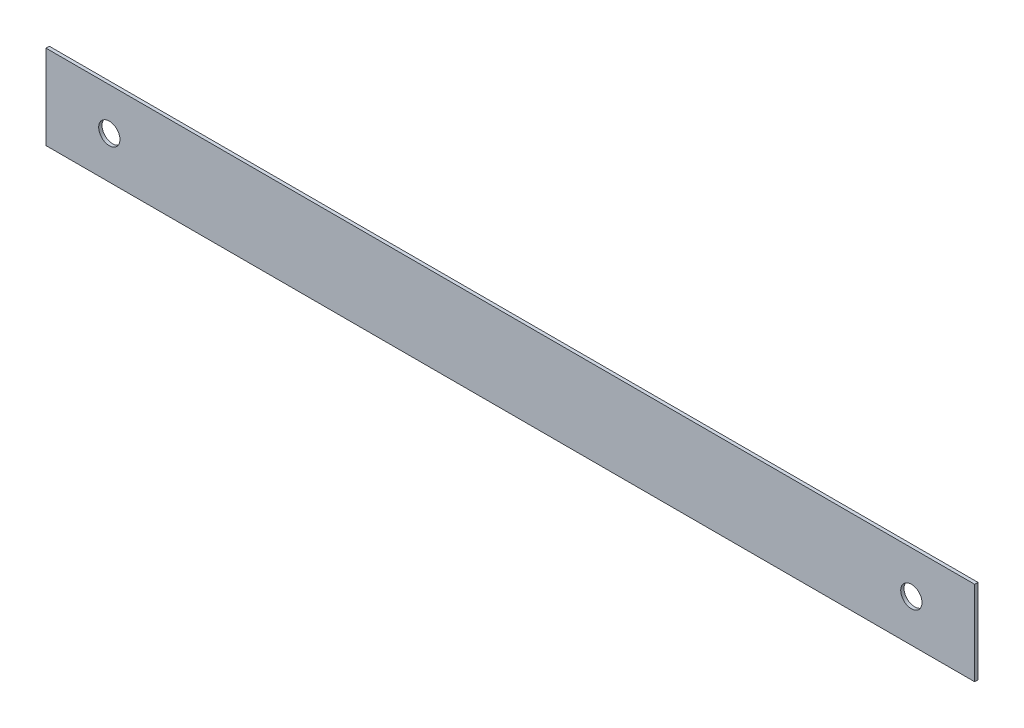
ISO-10303-21;
HEADER;
FILE_DESCRIPTION(('STEP AP214'),'2;1');
FILE_NAME('part.step','',(''),(''),'','','');
FILE_SCHEMA(('AUTOMOTIVE_DESIGN { 1 0 10303 214 1 1 1 1 }'));
ENDSEC;
DATA;
#1=APPLICATION_CONTEXT('core data for automotive mechanical design processes');
#2=APPLICATION_PROTOCOL_DEFINITION('international standard','automotive_design',2000,#1);
#3=PRODUCT_CONTEXT('',#1,'mechanical');
#4=PRODUCT('Part','Part','',(#3));
#5=PRODUCT_RELATED_PRODUCT_CATEGORY('part','',(#4));
#6=PRODUCT_DEFINITION_FORMATION('','',#4);
#7=PRODUCT_DEFINITION_CONTEXT('part definition',#1,'design');
#8=PRODUCT_DEFINITION('design','',#6,#7);
#9=PRODUCT_DEFINITION_SHAPE('','',#8);
#10=(LENGTH_UNIT() NAMED_UNIT(*) SI_UNIT(.MILLI.,.METRE.));
#11=(NAMED_UNIT(*) PLANE_ANGLE_UNIT() SI_UNIT($,.RADIAN.));
#12=(NAMED_UNIT(*) SI_UNIT($,.STERADIAN.) SOLID_ANGLE_UNIT());
#13=UNCERTAINTY_MEASURE_WITH_UNIT(LENGTH_MEASURE(1.E-05),#10,'distance_accuracy_value','');
#14=(GEOMETRIC_REPRESENTATION_CONTEXT(3) GLOBAL_UNCERTAINTY_ASSIGNED_CONTEXT((#13)) GLOBAL_UNIT_ASSIGNED_CONTEXT((#10,
#11,#12)) REPRESENTATION_CONTEXT('',''));
#15=CARTESIAN_POINT('',(0.,0.,0.));
#16=DIRECTION('',(0.,0.,1.));
#17=DIRECTION('',(1.,0.,0.));
#18=AXIS2_PLACEMENT_3D('',#15,#16,#17);
#19=CARTESIAN_POINT('',(0.,0.,0.5));
#20=DIRECTION('',(0.,0.,1.));
#21=DIRECTION('',(1.,0.,0.));
#22=AXIS2_PLACEMENT_3D('',#19,#20,#21);
#23=PLANE('',#22);
#24=CARTESIAN_POINT('',(0.,0.,0.5));
#25=DIRECTION('',(0.,0.,1.));
#26=DIRECTION('',(1.,0.,0.));
#27=AXIS2_PLACEMENT_3D('',#24,#25,#26);
#28=CIRCLE('',#27,1.6);
#29=CARTESIAN_POINT('',(1.6,0.,0.5));
#30=VERTEX_POINT('',#29);
#31=EDGE_CURVE('E106',#30,#30,#28,.T.);
#32=ORIENTED_EDGE('',*,*,#31,.F.);
#33=EDGE_LOOP('',(#32));
#34=FACE_BOUND('',#33,.T.);
#35=DIRECTION('',(0.,-1.,0.));
#36=VECTOR('',#35,1.);
#37=CARTESIAN_POINT('',(-9.525,6.35,0.5));
#38=LINE('',#37,#36);
#39=CARTESIAN_POINT('',(-9.525,6.35,0.5));
#40=VERTEX_POINT('',#39);
#41=CARTESIAN_POINT('',(-9.525,-6.35,0.5));
#42=VERTEX_POINT('',#41);
#43=EDGE_CURVE('E93',#40,#42,#38,.T.);
#44=ORIENTED_EDGE('',*,*,#43,.T.);
#45=DIRECTION('',(1.,0.,0.));
#46=VECTOR('',#45,1.);
#47=CARTESIAN_POINT('',(-9.525,-6.35,0.5));
#48=LINE('',#47,#46);
#49=CARTESIAN_POINT('',(130.175,-6.35,0.5));
#50=VERTEX_POINT('',#49);
#51=EDGE_CURVE('E88',#42,#50,#48,.T.);
#52=ORIENTED_EDGE('',*,*,#51,.T.);
#53=DIRECTION('',(0.,1.,0.));
#54=VECTOR('',#53,1.);
#55=CARTESIAN_POINT('',(130.175,-6.35,0.5));
#56=LINE('',#55,#54);
#57=CARTESIAN_POINT('',(130.175,6.35,0.5));
#58=VERTEX_POINT('',#57);
#59=EDGE_CURVE('E90',#50,#58,#56,.T.);
#60=ORIENTED_EDGE('',*,*,#59,.T.);
#61=DIRECTION('',(-1.,0.,0.));
#62=VECTOR('',#61,1.);
#63=CARTESIAN_POINT('',(130.175,6.35,0.5));
#64=LINE('',#63,#62);
#65=EDGE_CURVE('E57',#58,#40,#64,.T.);
#66=ORIENTED_EDGE('',*,*,#65,.T.);
#67=EDGE_LOOP('',(#44,#52,#60,#66));
#68=FACE_BOUND('',#67,.T.);
#69=CARTESIAN_POINT('',(120.65,0.,0.5));
#70=DIRECTION('',(0.,0.,1.));
#71=DIRECTION('',(1.,0.,0.));
#72=AXIS2_PLACEMENT_3D('',#69,#70,#71);
#73=CIRCLE('',#72,1.6);
#74=CARTESIAN_POINT('',(122.25,0.,0.5));
#75=VERTEX_POINT('',#74);
#76=EDGE_CURVE('E121',#75,#75,#73,.T.);
#77=ORIENTED_EDGE('',*,*,#76,.F.);
#78=EDGE_LOOP('',(#77));
#79=FACE_BOUND('',#78,.T.);
#80=ADVANCED_FACE('F39',(#34,#68,#79),#23,.T.);
#81=CARTESIAN_POINT('',(0.,0.,0.));
#82=DIRECTION('',(0.,0.,1.));
#83=DIRECTION('',(1.,0.,0.));
#84=AXIS2_PLACEMENT_3D('',#81,#82,#83);
#85=PLANE('',#84);
#86=DIRECTION('',(0.,-1.,0.));
#87=VECTOR('',#86,1.);
#88=CARTESIAN_POINT('',(-9.525,6.35,0.));
#89=LINE('',#88,#87);
#90=CARTESIAN_POINT('',(-9.525,6.35,0.));
#91=VERTEX_POINT('',#90);
#92=CARTESIAN_POINT('',(-9.525,-6.35,0.));
#93=VERTEX_POINT('',#92);
#94=EDGE_CURVE('E103',#91,#93,#89,.T.);
#95=ORIENTED_EDGE('',*,*,#94,.F.);
#96=DIRECTION('',(-1.,0.,0.));
#97=VECTOR('',#96,1.);
#98=CARTESIAN_POINT('',(130.175,6.35,0.));
#99=LINE('',#98,#97);
#100=CARTESIAN_POINT('',(130.175,6.35,0.));
#101=VERTEX_POINT('',#100);
#102=EDGE_CURVE('E76',#101,#91,#99,.T.);
#103=ORIENTED_EDGE('',*,*,#102,.F.);
#104=DIRECTION('',(0.,1.,0.));
#105=VECTOR('',#104,1.);
#106=CARTESIAN_POINT('',(130.175,-6.35,0.));
#107=LINE('',#106,#105);
#108=CARTESIAN_POINT('',(130.175,-6.35,0.));
#109=VERTEX_POINT('',#108);
#110=EDGE_CURVE('E71',#109,#101,#107,.T.);
#111=ORIENTED_EDGE('',*,*,#110,.F.);
#112=DIRECTION('',(1.,0.,0.));
#113=VECTOR('',#112,1.);
#114=CARTESIAN_POINT('',(-9.525,-6.35,0.));
#115=LINE('',#114,#113);
#116=EDGE_CURVE('E92',#93,#109,#115,.T.);
#117=ORIENTED_EDGE('',*,*,#116,.F.);
#118=EDGE_LOOP('',(#95,#103,#111,#117));
#119=FACE_BOUND('',#118,.T.);
#120=CARTESIAN_POINT('',(0.,0.,0.));
#121=DIRECTION('',(0.,0.,1.));
#122=DIRECTION('',(1.,0.,0.));
#123=AXIS2_PLACEMENT_3D('',#120,#121,#122);
#124=CIRCLE('',#123,1.6);
#125=CARTESIAN_POINT('',(1.6,0.,0.));
#126=VERTEX_POINT('',#125);
#127=EDGE_CURVE('E119',#126,#126,#124,.T.);
#128=ORIENTED_EDGE('',*,*,#127,.T.);
#129=EDGE_LOOP('',(#128));
#130=FACE_BOUND('',#129,.T.);
#131=CARTESIAN_POINT('',(120.65,0.,0.));
#132=DIRECTION('',(0.,0.,1.));
#133=DIRECTION('',(1.,0.,0.));
#134=AXIS2_PLACEMENT_3D('',#131,#132,#133);
#135=CIRCLE('',#134,1.6);
#136=CARTESIAN_POINT('',(122.25,0.,0.));
#137=VERTEX_POINT('',#136);
#138=EDGE_CURVE('E123',#137,#137,#135,.T.);
#139=ORIENTED_EDGE('',*,*,#138,.T.);
#140=EDGE_LOOP('',(#139));
#141=FACE_BOUND('',#140,.T.);
#142=ADVANCED_FACE('F111',(#119,#130,#141),#85,.F.);
#143=CARTESIAN_POINT('',(-9.525,6.35,0.5));
#144=DIRECTION('',(1.,0.,0.));
#145=DIRECTION('',(0.,0.,-1.));
#146=AXIS2_PLACEMENT_3D('',#143,#144,#145);
#147=PLANE('',#146);
#148=ORIENTED_EDGE('',*,*,#94,.T.);
#149=DIRECTION('',(0.,0.,-1.));
#150=VECTOR('',#149,1.);
#151=CARTESIAN_POINT('',(-9.525,-6.35,0.5));
#152=LINE('',#151,#150);
#153=EDGE_CURVE('E11',#42,#93,#152,.T.);
#154=ORIENTED_EDGE('',*,*,#153,.F.);
#155=ORIENTED_EDGE('',*,*,#43,.F.);
#156=DIRECTION('',(0.,0.,-1.));
#157=VECTOR('',#156,1.);
#158=CARTESIAN_POINT('',(-9.525,6.35,0.5));
#159=LINE('',#158,#157);
#160=EDGE_CURVE('E97',#40,#91,#159,.T.);
#161=ORIENTED_EDGE('',*,*,#160,.T.);
#162=EDGE_LOOP('',(#148,#154,#155,#161));
#163=FACE_BOUND('',#162,.T.);
#164=ADVANCED_FACE('F41',(#163),#147,.F.);
#165=CARTESIAN_POINT('',(-9.525,-6.35,0.5));
#166=DIRECTION('',(0.,1.,0.));
#167=DIRECTION('',(0.,0.,1.));
#168=AXIS2_PLACEMENT_3D('',#165,#166,#167);
#169=PLANE('',#168);
#170=ORIENTED_EDGE('',*,*,#116,.T.);
#171=DIRECTION('',(0.,0.,-1.));
#172=VECTOR('',#171,1.);
#173=CARTESIAN_POINT('',(130.175,-6.35,0.5));
#174=LINE('',#173,#172);
#175=EDGE_CURVE('E48',#50,#109,#174,.T.);
#176=ORIENTED_EDGE('',*,*,#175,.F.);
#177=ORIENTED_EDGE('',*,*,#51,.F.);
#178=ORIENTED_EDGE('',*,*,#153,.T.);
#179=EDGE_LOOP('',(#170,#176,#177,#178));
#180=FACE_BOUND('',#179,.T.);
#181=ADVANCED_FACE('F94',(#180),#169,.F.);
#182=CARTESIAN_POINT('',(130.175,-6.35,0.5));
#183=DIRECTION('',(-1.,0.,0.));
#184=DIRECTION('',(0.,0.,1.));
#185=AXIS2_PLACEMENT_3D('',#182,#183,#184);
#186=PLANE('',#185);
#187=ORIENTED_EDGE('',*,*,#110,.T.);
#188=DIRECTION('',(0.,0.,-1.));
#189=VECTOR('',#188,1.);
#190=CARTESIAN_POINT('',(130.175,6.35,0.5));
#191=LINE('',#190,#189);
#192=EDGE_CURVE('E96',#58,#101,#191,.T.);
#193=ORIENTED_EDGE('',*,*,#192,.F.);
#194=ORIENTED_EDGE('',*,*,#59,.F.);
#195=ORIENTED_EDGE('',*,*,#175,.T.);
#196=EDGE_LOOP('',(#187,#193,#194,#195));
#197=FACE_BOUND('',#196,.T.);
#198=ADVANCED_FACE('F100',(#197),#186,.F.);
#199=CARTESIAN_POINT('',(130.175,6.35,0.5));
#200=DIRECTION('',(0.,-1.,0.));
#201=DIRECTION('',(0.,0.,-1.));
#202=AXIS2_PLACEMENT_3D('',#199,#200,#201);
#203=PLANE('',#202);
#204=ORIENTED_EDGE('',*,*,#102,.T.);
#205=ORIENTED_EDGE('',*,*,#160,.F.);
#206=ORIENTED_EDGE('',*,*,#65,.F.);
#207=ORIENTED_EDGE('',*,*,#192,.T.);
#208=EDGE_LOOP('',(#204,#205,#206,#207));
#209=FACE_BOUND('',#208,.T.);
#210=ADVANCED_FACE('F112',(#209),#203,.F.);
#211=CARTESIAN_POINT('',(0.,0.,0.5));
#212=DIRECTION('',(0.,0.,-1.));
#213=DIRECTION('',(-1.,0.,0.));
#214=AXIS2_PLACEMENT_3D('',#211,#212,#213);
#215=CYLINDRICAL_SURFACE('',#214,1.6);
#216=ORIENTED_EDGE('',*,*,#31,.T.);
#217=EDGE_LOOP('',(#216));
#218=FACE_BOUND('',#217,.T.);
#219=ORIENTED_EDGE('',*,*,#127,.F.);
#220=EDGE_LOOP('',(#219));
#221=FACE_BOUND('',#220,.T.);
#222=ADVANCED_FACE('F143',(#218,#221),#215,.F.);
#223=CARTESIAN_POINT('',(120.65,0.,0.5));
#224=DIRECTION('',(0.,0.,-1.));
#225=DIRECTION('',(-1.,0.,0.));
#226=AXIS2_PLACEMENT_3D('',#223,#224,#225);
#227=CYLINDRICAL_SURFACE('',#226,1.6);
#228=ORIENTED_EDGE('',*,*,#76,.T.);
#229=EDGE_LOOP('',(#228));
#230=FACE_BOUND('',#229,.T.);
#231=ORIENTED_EDGE('',*,*,#138,.F.);
#232=EDGE_LOOP('',(#231));
#233=FACE_BOUND('',#232,.T.);
#234=ADVANCED_FACE('F128',(#230,#233),#227,.F.);
#235=CLOSED_SHELL('',(#80,#142,#164,#181,#198,#210,#222,#234));
#236=MANIFOLD_SOLID_BREP('B2',#235);
#237=ADVANCED_BREP_SHAPE_REPRESENTATION('',(#18,#236),#14);
#238=SHAPE_DEFINITION_REPRESENTATION(#9,#237);
ENDSEC;
END-ISO-10303-21;
